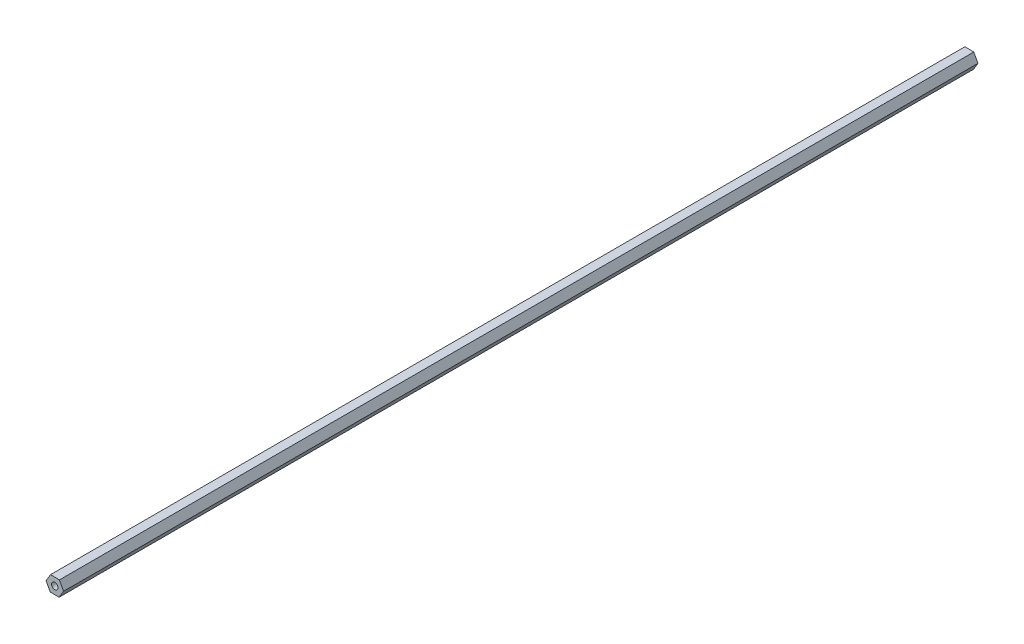
ISO-10303-21;
HEADER;
FILE_DESCRIPTION(('STEP AP214'),'2;1');
FILE_NAME('part.step','',(''),(''),'','','');
FILE_SCHEMA(('AUTOMOTIVE_DESIGN { 1 0 10303 214 1 1 1 1 }'));
ENDSEC;
DATA;
#1=APPLICATION_CONTEXT('core data for automotive mechanical design processes');
#2=APPLICATION_PROTOCOL_DEFINITION('international standard','automotive_design',2000,#1);
#3=PRODUCT_CONTEXT('',#1,'mechanical');
#4=PRODUCT('Part','Part','',(#3));
#5=PRODUCT_RELATED_PRODUCT_CATEGORY('part','',(#4));
#6=PRODUCT_DEFINITION_FORMATION('','',#4);
#7=PRODUCT_DEFINITION_CONTEXT('part definition',#1,'design');
#8=PRODUCT_DEFINITION('design','',#6,#7);
#9=PRODUCT_DEFINITION_SHAPE('','',#8);
#10=(LENGTH_UNIT() NAMED_UNIT(*) SI_UNIT(.MILLI.,.METRE.));
#11=(NAMED_UNIT(*) PLANE_ANGLE_UNIT() SI_UNIT($,.RADIAN.));
#12=(NAMED_UNIT(*) SI_UNIT($,.STERADIAN.) SOLID_ANGLE_UNIT());
#13=UNCERTAINTY_MEASURE_WITH_UNIT(LENGTH_MEASURE(1.E-05),#10,'distance_accuracy_value','');
#14=(GEOMETRIC_REPRESENTATION_CONTEXT(3) GLOBAL_UNCERTAINTY_ASSIGNED_CONTEXT((#13)) GLOBAL_UNIT_ASSIGNED_CONTEXT((#10,
#11,#12)) REPRESENTATION_CONTEXT('',''));
#15=CARTESIAN_POINT('',(0.,0.,0.));
#16=DIRECTION('',(0.,0.,1.));
#17=DIRECTION('',(1.,0.,0.));
#18=AXIS2_PLACEMENT_3D('',#15,#16,#17);
#19=CARTESIAN_POINT('',(0.,0.,762.));
#20=DIRECTION('',(0.,0.,1.));
#21=DIRECTION('',(1.,0.,0.));
#22=AXIS2_PLACEMENT_3D('',#19,#20,#21);
#23=PLANE('',#22);
#24=DIRECTION('',(0.999731866371023,-0.0231558926044917,0.));
#25=VECTOR('',#24,1.);
#26=CARTESIAN_POINT('',(-3.81223110279743,-6.26340381519484,762.));
#27=LINE('',#26,#25);
#28=CARTESIAN_POINT('',(-3.81223110279743,-6.26340381519484,762.));
#29=VERTEX_POINT('',#28);
#30=CARTESIAN_POINT('',(3.51815126672039,-6.43319088771716,762.));
#31=VERTEX_POINT('',#30);
#32=EDGE_CURVE('E156',#29,#31,#27,.T.);
#33=ORIENTED_EDGE('',*,*,#32,.T.);
#34=DIRECTION('',(0.519919524428305,0.85421524694789,0.));
#35=VECTOR('',#34,1.);
#36=CARTESIAN_POINT('',(3.51815126672039,-6.43319088771716,762.));
#37=LINE('',#36,#35);
#38=CARTESIAN_POINT('',(7.33038236951782,-0.169787072522322,762.));
#39=VERTEX_POINT('',#38);
#40=EDGE_CURVE('E114',#31,#39,#37,.T.);
#41=ORIENTED_EDGE('',*,*,#40,.T.);
#42=DIRECTION('',(-0.479812341942718,0.877371139552381,0.));
#43=VECTOR('',#42,1.);
#44=CARTESIAN_POINT('',(7.33038236951782,-0.169787072522322,762.));
#45=LINE('',#44,#43);
#46=CARTESIAN_POINT('',(3.81223110279743,6.26340381519484,762.));
#47=VERTEX_POINT('',#46);
#48=EDGE_CURVE('E127',#39,#47,#45,.T.);
#49=ORIENTED_EDGE('',*,*,#48,.T.);
#50=DIRECTION('',(-0.999731866371023,0.0231558926044912,0.));
#51=VECTOR('',#50,1.);
#52=CARTESIAN_POINT('',(3.81223110279743,6.26340381519484,762.));
#53=LINE('',#52,#51);
#54=CARTESIAN_POINT('',(-3.5181512667204,6.43319088771715,762.));
#55=VERTEX_POINT('',#54);
#56=EDGE_CURVE('E121',#47,#55,#53,.T.);
#57=ORIENTED_EDGE('',*,*,#56,.T.);
#58=DIRECTION('',(-0.519919524428305,-0.85421524694789,0.));
#59=VECTOR('',#58,1.);
#60=CARTESIAN_POINT('',(-3.5181512667204,6.43319088771715,762.));
#61=LINE('',#60,#59);
#62=CARTESIAN_POINT('',(-7.33038236951783,0.169787072522324,762.));
#63=VERTEX_POINT('',#62);
#64=EDGE_CURVE('E125',#55,#63,#61,.T.);
#65=ORIENTED_EDGE('',*,*,#64,.T.);
#66=DIRECTION('',(0.479812341942718,-0.877371139552381,0.));
#67=VECTOR('',#66,1.);
#68=CARTESIAN_POINT('',(-7.33038236951783,0.169787072522324,762.));
#69=LINE('',#68,#67);
#70=EDGE_CURVE('E77',#63,#29,#69,.T.);
#71=ORIENTED_EDGE('',*,*,#70,.T.);
#72=EDGE_LOOP('',(#33,#41,#49,#57,#65,#71));
#73=FACE_BOUND('',#72,.T.);
#74=CARTESIAN_POINT('',(0.,0.,762.));
#75=DIRECTION('',(0.,0.,1.));
#76=DIRECTION('',(1.,0.,0.));
#77=AXIS2_PLACEMENT_3D('',#74,#75,#76);
#78=CIRCLE('',#77,2.667);
#79=CARTESIAN_POINT('',(2.667,0.,762.));
#80=VERTEX_POINT('',#79);
#81=EDGE_CURVE('E149',#80,#80,#78,.T.);
#82=ORIENTED_EDGE('',*,*,#81,.F.);
#83=EDGE_LOOP('',(#82));
#84=FACE_BOUND('',#83,.T.);
#85=ADVANCED_FACE('F60',(#73,#84),#23,.T.);
#86=CARTESIAN_POINT('',(0.,0.,0.));
#87=DIRECTION('',(0.,0.,1.));
#88=DIRECTION('',(1.,0.,0.));
#89=AXIS2_PLACEMENT_3D('',#86,#87,#88);
#90=PLANE('',#89);
#91=DIRECTION('',(0.999731866371023,-0.0231558926044917,0.));
#92=VECTOR('',#91,1.);
#93=CARTESIAN_POINT('',(-3.81223110279743,-6.26340381519484,0.));
#94=LINE('',#93,#92);
#95=CARTESIAN_POINT('',(-3.81223110279743,-6.26340381519484,0.));
#96=VERTEX_POINT('',#95);
#97=CARTESIAN_POINT('',(3.51815126672039,-6.43319088771716,0.));
#98=VERTEX_POINT('',#97);
#99=EDGE_CURVE('E145',#96,#98,#94,.T.);
#100=ORIENTED_EDGE('',*,*,#99,.F.);
#101=DIRECTION('',(0.479812341942718,-0.877371139552381,0.));
#102=VECTOR('',#101,1.);
#103=CARTESIAN_POINT('',(-7.33038236951783,0.169787072522324,0.));
#104=LINE('',#103,#102);
#105=CARTESIAN_POINT('',(-7.33038236951783,0.169787072522324,0.));
#106=VERTEX_POINT('',#105);
#107=EDGE_CURVE('E106',#106,#96,#104,.T.);
#108=ORIENTED_EDGE('',*,*,#107,.F.);
#109=DIRECTION('',(-0.519919524428305,-0.85421524694789,0.));
#110=VECTOR('',#109,1.);
#111=CARTESIAN_POINT('',(-3.5181512667204,6.43319088771715,0.));
#112=LINE('',#111,#110);
#113=CARTESIAN_POINT('',(-3.5181512667204,6.43319088771715,0.));
#114=VERTEX_POINT('',#113);
#115=EDGE_CURVE('E100',#114,#106,#112,.T.);
#116=ORIENTED_EDGE('',*,*,#115,.F.);
#117=DIRECTION('',(-0.999731866371023,0.0231558926044912,0.));
#118=VECTOR('',#117,1.);
#119=CARTESIAN_POINT('',(3.81223110279743,6.26340381519484,0.));
#120=LINE('',#119,#118);
#121=CARTESIAN_POINT('',(3.81223110279743,6.26340381519484,0.));
#122=VERTEX_POINT('',#121);
#123=EDGE_CURVE('E135',#122,#114,#120,.T.);
#124=ORIENTED_EDGE('',*,*,#123,.F.);
#125=DIRECTION('',(-0.479812341942718,0.877371139552381,0.));
#126=VECTOR('',#125,1.);
#127=CARTESIAN_POINT('',(7.33038236951782,-0.169787072522322,0.));
#128=LINE('',#127,#126);
#129=CARTESIAN_POINT('',(7.33038236951782,-0.169787072522322,0.));
#130=VERTEX_POINT('',#129);
#131=EDGE_CURVE('E151',#130,#122,#128,.T.);
#132=ORIENTED_EDGE('',*,*,#131,.F.);
#133=DIRECTION('',(0.519919524428305,0.85421524694789,0.));
#134=VECTOR('',#133,1.);
#135=CARTESIAN_POINT('',(3.51815126672039,-6.43319088771716,0.));
#136=LINE('',#135,#134);
#137=EDGE_CURVE('E148',#98,#130,#136,.T.);
#138=ORIENTED_EDGE('',*,*,#137,.F.);
#139=EDGE_LOOP('',(#100,#108,#116,#124,#132,#138));
#140=FACE_BOUND('',#139,.T.);
#141=CARTESIAN_POINT('',(0.,0.,0.));
#142=DIRECTION('',(0.,0.,1.));
#143=DIRECTION('',(1.,0.,0.));
#144=AXIS2_PLACEMENT_3D('',#141,#142,#143);
#145=CIRCLE('',#144,2.667);
#146=CARTESIAN_POINT('',(2.667,0.,0.));
#147=VERTEX_POINT('',#146);
#148=EDGE_CURVE('E249',#147,#147,#145,.T.);
#149=ORIENTED_EDGE('',*,*,#148,.T.);
#150=EDGE_LOOP('',(#149));
#151=FACE_BOUND('',#150,.T.);
#152=ADVANCED_FACE('F165',(#140,#151),#90,.F.);
#153=CARTESIAN_POINT('',(-3.81223110279743,-6.26340381519484,762.));
#154=DIRECTION('',(0.0231558926044917,0.999731866371023,0.));
#155=DIRECTION('',(-0.999731866371023,0.0231558926044917,0.));
#156=AXIS2_PLACEMENT_3D('',#153,#154,#155);
#157=PLANE('',#156);
#158=ORIENTED_EDGE('',*,*,#99,.T.);
#159=DIRECTION('',(0.,0.,-1.));
#160=VECTOR('',#159,1.);
#161=CARTESIAN_POINT('',(3.51815126672039,-6.43319088771716,762.));
#162=LINE('',#161,#160);
#163=EDGE_CURVE('E12',#31,#98,#162,.T.);
#164=ORIENTED_EDGE('',*,*,#163,.F.);
#165=ORIENTED_EDGE('',*,*,#32,.F.);
#166=DIRECTION('',(0.,0.,-1.));
#167=VECTOR('',#166,1.);
#168=CARTESIAN_POINT('',(-3.81223110279743,-6.26340381519484,762.));
#169=LINE('',#168,#167);
#170=EDGE_CURVE('E141',#29,#96,#169,.T.);
#171=ORIENTED_EDGE('',*,*,#170,.T.);
#172=EDGE_LOOP('',(#158,#164,#165,#171));
#173=FACE_BOUND('',#172,.T.);
#174=ADVANCED_FACE('F62',(#173),#157,.F.);
#175=CARTESIAN_POINT('',(3.51815126672039,-6.43319088771716,762.));
#176=DIRECTION('',(-0.85421524694789,0.519919524428305,0.));
#177=DIRECTION('',(-0.519919524428305,-0.85421524694789,0.));
#178=AXIS2_PLACEMENT_3D('',#175,#176,#177);
#179=PLANE('',#178);
#180=ORIENTED_EDGE('',*,*,#137,.T.);
#181=DIRECTION('',(0.,0.,-1.));
#182=VECTOR('',#181,1.);
#183=CARTESIAN_POINT('',(7.33038236951782,-0.169787072522322,762.));
#184=LINE('',#183,#182);
#185=EDGE_CURVE('E69',#39,#130,#184,.T.);
#186=ORIENTED_EDGE('',*,*,#185,.F.);
#187=ORIENTED_EDGE('',*,*,#40,.F.);
#188=ORIENTED_EDGE('',*,*,#163,.T.);
#189=EDGE_LOOP('',(#180,#186,#187,#188));
#190=FACE_BOUND('',#189,.T.);
#191=ADVANCED_FACE('F190',(#190),#179,.F.);
#192=CARTESIAN_POINT('',(7.33038236951782,-0.169787072522322,762.));
#193=DIRECTION('',(-0.877371139552381,-0.479812341942718,0.));
#194=DIRECTION('',(0.479812341942718,-0.877371139552381,0.));
#195=AXIS2_PLACEMENT_3D('',#192,#193,#194);
#196=PLANE('',#195);
#197=ORIENTED_EDGE('',*,*,#131,.T.);
#198=DIRECTION('',(0.,0.,-1.));
#199=VECTOR('',#198,1.);
#200=CARTESIAN_POINT('',(3.81223110279743,6.26340381519484,762.));
#201=LINE('',#200,#199);
#202=EDGE_CURVE('E136',#47,#122,#201,.T.);
#203=ORIENTED_EDGE('',*,*,#202,.F.);
#204=ORIENTED_EDGE('',*,*,#48,.F.);
#205=ORIENTED_EDGE('',*,*,#185,.T.);
#206=EDGE_LOOP('',(#197,#203,#204,#205));
#207=FACE_BOUND('',#206,.T.);
#208=ADVANCED_FACE('F162',(#207),#196,.F.);
#209=CARTESIAN_POINT('',(3.81223110279743,6.26340381519484,762.));
#210=DIRECTION('',(-0.0231558926044912,-0.999731866371023,0.));
#211=DIRECTION('',(0.999731866371023,-0.0231558926044912,0.));
#212=AXIS2_PLACEMENT_3D('',#209,#210,#211);
#213=PLANE('',#212);
#214=ORIENTED_EDGE('',*,*,#123,.T.);
#215=DIRECTION('',(0.,0.,-1.));
#216=VECTOR('',#215,1.);
#217=CARTESIAN_POINT('',(-3.5181512667204,6.43319088771715,762.));
#218=LINE('',#217,#216);
#219=EDGE_CURVE('E132',#55,#114,#218,.T.);
#220=ORIENTED_EDGE('',*,*,#219,.F.);
#221=ORIENTED_EDGE('',*,*,#56,.F.);
#222=ORIENTED_EDGE('',*,*,#202,.T.);
#223=EDGE_LOOP('',(#214,#220,#221,#222));
#224=FACE_BOUND('',#223,.T.);
#225=ADVANCED_FACE('F133',(#224),#213,.F.);
#226=CARTESIAN_POINT('',(-3.5181512667204,6.43319088771715,762.));
#227=DIRECTION('',(0.85421524694789,-0.519919524428305,0.));
#228=DIRECTION('',(0.519919524428305,0.85421524694789,0.));
#229=AXIS2_PLACEMENT_3D('',#226,#227,#228);
#230=PLANE('',#229);
#231=ORIENTED_EDGE('',*,*,#115,.T.);
#232=DIRECTION('',(0.,0.,-1.));
#233=VECTOR('',#232,1.);
#234=CARTESIAN_POINT('',(-7.33038236951783,0.169787072522324,762.));
#235=LINE('',#234,#233);
#236=EDGE_CURVE('E137',#63,#106,#235,.T.);
#237=ORIENTED_EDGE('',*,*,#236,.F.);
#238=ORIENTED_EDGE('',*,*,#64,.F.);
#239=ORIENTED_EDGE('',*,*,#219,.T.);
#240=EDGE_LOOP('',(#231,#237,#238,#239));
#241=FACE_BOUND('',#240,.T.);
#242=ADVANCED_FACE('F139',(#241),#230,.F.);
#243=CARTESIAN_POINT('',(-7.33038236951783,0.169787072522324,762.));
#244=DIRECTION('',(0.877371139552381,0.479812341942718,0.));
#245=DIRECTION('',(-0.479812341942718,0.877371139552381,0.));
#246=AXIS2_PLACEMENT_3D('',#243,#244,#245);
#247=PLANE('',#246);
#248=ORIENTED_EDGE('',*,*,#107,.T.);
#249=ORIENTED_EDGE('',*,*,#170,.F.);
#250=ORIENTED_EDGE('',*,*,#70,.F.);
#251=ORIENTED_EDGE('',*,*,#236,.T.);
#252=EDGE_LOOP('',(#248,#249,#250,#251));
#253=FACE_BOUND('',#252,.T.);
#254=ADVANCED_FACE('F170',(#253),#247,.F.);
#255=CARTESIAN_POINT('',(0.,0.,762.));
#256=DIRECTION('',(0.,0.,-1.));
#257=DIRECTION('',(-1.,0.,0.));
#258=AXIS2_PLACEMENT_3D('',#255,#256,#257);
#259=CYLINDRICAL_SURFACE('',#258,2.667);
#260=ORIENTED_EDGE('',*,*,#81,.T.);
#261=EDGE_LOOP('',(#260));
#262=FACE_BOUND('',#261,.T.);
#263=ORIENTED_EDGE('',*,*,#148,.F.);
#264=EDGE_LOOP('',(#263));
#265=FACE_BOUND('',#264,.T.);
#266=ADVANCED_FACE('F172',(#262,#265),#259,.F.);
#267=CLOSED_SHELL('',(#85,#152,#174,#191,#208,#225,#242,#254,#266));
#268=MANIFOLD_SOLID_BREP('B2',#267);
#269=ADVANCED_BREP_SHAPE_REPRESENTATION('',(#18,#268),#14);
#270=SHAPE_DEFINITION_REPRESENTATION(#9,#269);
ENDSEC;
END-ISO-10303-21;
